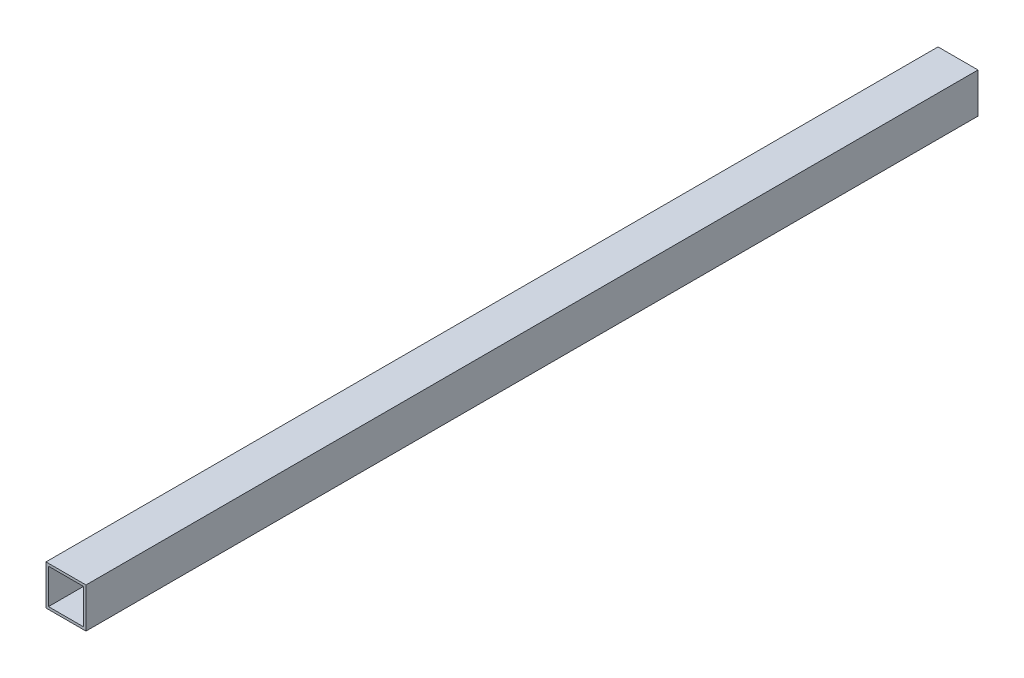
ISO-10303-21;
HEADER;
FILE_DESCRIPTION(('STEP AP214'),'2;1');
FILE_NAME('part.step','',(''),(''),'','','');
FILE_SCHEMA(('AUTOMOTIVE_DESIGN { 1 0 10303 214 1 1 1 1 }'));
ENDSEC;
DATA;
#1=APPLICATION_CONTEXT('core data for automotive mechanical design processes');
#2=APPLICATION_PROTOCOL_DEFINITION('international standard','automotive_design',2000,#1);
#3=PRODUCT_CONTEXT('',#1,'mechanical');
#4=PRODUCT('Part','Part','',(#3));
#5=PRODUCT_RELATED_PRODUCT_CATEGORY('part','',(#4));
#6=PRODUCT_DEFINITION_FORMATION('','',#4);
#7=PRODUCT_DEFINITION_CONTEXT('part definition',#1,'design');
#8=PRODUCT_DEFINITION('design','',#6,#7);
#9=PRODUCT_DEFINITION_SHAPE('','',#8);
#10=(LENGTH_UNIT() NAMED_UNIT(*) SI_UNIT(.MILLI.,.METRE.));
#11=(NAMED_UNIT(*) PLANE_ANGLE_UNIT() SI_UNIT($,.RADIAN.));
#12=(NAMED_UNIT(*) SI_UNIT($,.STERADIAN.) SOLID_ANGLE_UNIT());
#13=UNCERTAINTY_MEASURE_WITH_UNIT(LENGTH_MEASURE(1.E-05),#10,'distance_accuracy_value','');
#14=(GEOMETRIC_REPRESENTATION_CONTEXT(3) GLOBAL_UNCERTAINTY_ASSIGNED_CONTEXT((#13)) GLOBAL_UNIT_ASSIGNED_CONTEXT((#10,
#11,#12)) REPRESENTATION_CONTEXT('',''));
#15=CARTESIAN_POINT('',(0.,0.,0.));
#16=DIRECTION('',(0.,0.,1.));
#17=DIRECTION('',(1.,0.,0.));
#18=AXIS2_PLACEMENT_3D('',#15,#16,#17);
#19=CARTESIAN_POINT('',(0.,0.,-1700.));
#20=DIRECTION('',(-1.,0.,0.));
#21=DIRECTION('',(0.,-1.,0.));
#22=AXIS2_PLACEMENT_3D('',#19,#20,#21);
#23=PLANE('',#22);
#24=DIRECTION('',(0.,-1.,0.));
#25=VECTOR('',#24,1.);
#26=CARTESIAN_POINT('',(0.,0.,0.));
#27=LINE('',#26,#25);
#28=CARTESIAN_POINT('',(0.,0.,0.));
#29=VERTEX_POINT('',#28);
#30=CARTESIAN_POINT('',(0.,-76.2,0.));
#31=VERTEX_POINT('',#30);
#32=EDGE_CURVE('E133',#29,#31,#27,.T.);
#33=ORIENTED_EDGE('',*,*,#32,.F.);
#34=DIRECTION('',(0.,0.,1.));
#35=VECTOR('',#34,1.);
#36=CARTESIAN_POINT('',(0.,0.,-1700.));
#37=LINE('',#36,#35);
#38=CARTESIAN_POINT('',(0.,0.,-1700.));
#39=VERTEX_POINT('',#38);
#40=EDGE_CURVE('E11',#39,#29,#37,.T.);
#41=ORIENTED_EDGE('',*,*,#40,.F.);
#42=DIRECTION('',(0.,-1.,0.));
#43=VECTOR('',#42,1.);
#44=CARTESIAN_POINT('',(0.,0.,-1700.));
#45=LINE('',#44,#43);
#46=CARTESIAN_POINT('',(0.,-76.2,-1700.));
#47=VERTEX_POINT('',#46);
#48=EDGE_CURVE('E137',#39,#47,#45,.T.);
#49=ORIENTED_EDGE('',*,*,#48,.T.);
#50=DIRECTION('',(0.,0.,1.));
#51=VECTOR('',#50,1.);
#52=CARTESIAN_POINT('',(0.,-76.2,-1700.));
#53=LINE('',#52,#51);
#54=EDGE_CURVE('E38',#47,#31,#53,.T.);
#55=ORIENTED_EDGE('',*,*,#54,.T.);
#56=EDGE_LOOP('',(#33,#41,#49,#55));
#57=FACE_BOUND('',#56,.T.);
#58=ADVANCED_FACE('F35',(#57),#23,.T.);
#59=CARTESIAN_POINT('',(0.,0.,-1700.));
#60=DIRECTION('',(0.,1.,0.));
#61=DIRECTION('',(0.,0.,1.));
#62=AXIS2_PLACEMENT_3D('',#59,#60,#61);
#63=PLANE('',#62);
#64=DIRECTION('',(-1.,0.,0.));
#65=VECTOR('',#64,1.);
#66=CARTESIAN_POINT('',(0.,0.,0.));
#67=LINE('',#66,#65);
#68=CARTESIAN_POINT('',(76.2,0.,0.));
#69=VERTEX_POINT('',#68);
#70=EDGE_CURVE('E141',#69,#29,#67,.T.);
#71=ORIENTED_EDGE('',*,*,#70,.F.);
#72=DIRECTION('',(0.,0.,1.));
#73=VECTOR('',#72,1.);
#74=CARTESIAN_POINT('',(76.2,0.,-1700.));
#75=LINE('',#74,#73);
#76=CARTESIAN_POINT('',(76.2,0.,-1700.));
#77=VERTEX_POINT('',#76);
#78=EDGE_CURVE('E43',#77,#69,#75,.T.);
#79=ORIENTED_EDGE('',*,*,#78,.F.);
#80=DIRECTION('',(-1.,0.,0.));
#81=VECTOR('',#80,1.);
#82=CARTESIAN_POINT('',(0.,0.,-1700.));
#83=LINE('',#82,#81);
#84=EDGE_CURVE('E147',#77,#39,#83,.T.);
#85=ORIENTED_EDGE('',*,*,#84,.T.);
#86=ORIENTED_EDGE('',*,*,#40,.T.);
#87=EDGE_LOOP('',(#71,#79,#85,#86));
#88=FACE_BOUND('',#87,.T.);
#89=ADVANCED_FACE('F173',(#88),#63,.T.);
#90=CARTESIAN_POINT('',(76.2,0.,-1700.));
#91=DIRECTION('',(1.,0.,0.));
#92=DIRECTION('',(0.,1.,0.));
#93=AXIS2_PLACEMENT_3D('',#90,#91,#92);
#94=PLANE('',#93);
#95=DIRECTION('',(0.,1.,0.));
#96=VECTOR('',#95,1.);
#97=CARTESIAN_POINT('',(76.2,0.,0.));
#98=LINE('',#97,#96);
#99=CARTESIAN_POINT('',(76.2,-76.2,0.));
#100=VERTEX_POINT('',#99);
#101=EDGE_CURVE('E155',#100,#69,#98,.T.);
#102=ORIENTED_EDGE('',*,*,#101,.F.);
#103=DIRECTION('',(0.,0.,1.));
#104=VECTOR('',#103,1.);
#105=CARTESIAN_POINT('',(76.2,-76.2,-1700.));
#106=LINE('',#105,#104);
#107=CARTESIAN_POINT('',(76.2,-76.2,-1700.));
#108=VERTEX_POINT('',#107);
#109=EDGE_CURVE('E160',#108,#100,#106,.T.);
#110=ORIENTED_EDGE('',*,*,#109,.F.);
#111=DIRECTION('',(0.,1.,0.));
#112=VECTOR('',#111,1.);
#113=CARTESIAN_POINT('',(76.2,0.,-1700.));
#114=LINE('',#113,#112);
#115=EDGE_CURVE('E144',#108,#77,#114,.T.);
#116=ORIENTED_EDGE('',*,*,#115,.T.);
#117=ORIENTED_EDGE('',*,*,#78,.T.);
#118=EDGE_LOOP('',(#102,#110,#116,#117));
#119=FACE_BOUND('',#118,.T.);
#120=ADVANCED_FACE('F177',(#119),#94,.T.);
#121=CARTESIAN_POINT('',(0.,-76.2,-1700.));
#122=DIRECTION('',(0.,-1.,0.));
#123=DIRECTION('',(0.,0.,-1.));
#124=AXIS2_PLACEMENT_3D('',#121,#122,#123);
#125=PLANE('',#124);
#126=DIRECTION('',(1.,0.,0.));
#127=VECTOR('',#126,1.);
#128=CARTESIAN_POINT('',(0.,-76.2,0.));
#129=LINE('',#128,#127);
#130=EDGE_CURVE('E152',#31,#100,#129,.T.);
#131=ORIENTED_EDGE('',*,*,#130,.F.);
#132=ORIENTED_EDGE('',*,*,#54,.F.);
#133=DIRECTION('',(1.,0.,0.));
#134=VECTOR('',#133,1.);
#135=CARTESIAN_POINT('',(0.,-76.2,-1700.));
#136=LINE('',#135,#134);
#137=EDGE_CURVE('E140',#47,#108,#136,.T.);
#138=ORIENTED_EDGE('',*,*,#137,.T.);
#139=ORIENTED_EDGE('',*,*,#109,.T.);
#140=EDGE_LOOP('',(#131,#132,#138,#139));
#141=FACE_BOUND('',#140,.T.);
#142=ADVANCED_FACE('F168',(#141),#125,.T.);
#143=CARTESIAN_POINT('',(0.,0.,-1700.));
#144=DIRECTION('',(0.,0.,1.));
#145=DIRECTION('',(1.,0.,0.));
#146=AXIS2_PLACEMENT_3D('',#143,#144,#145);
#147=PLANE('',#146);
#148=DIRECTION('',(-1.,0.,0.));
#149=VECTOR('',#148,1.);
#150=CARTESIAN_POINT('',(4.7625,-4.7625,-1700.));
#151=LINE('',#150,#149);
#152=CARTESIAN_POINT('',(71.4375,-4.7625,-1700.));
#153=VERTEX_POINT('',#152);
#154=CARTESIAN_POINT('',(4.7625,-4.7625,-1700.));
#155=VERTEX_POINT('',#154);
#156=EDGE_CURVE('E108',#153,#155,#151,.T.);
#157=ORIENTED_EDGE('',*,*,#156,.T.);
#158=DIRECTION('',(0.,-1.,0.));
#159=VECTOR('',#158,1.);
#160=CARTESIAN_POINT('',(4.7625,-4.7625,-1700.));
#161=LINE('',#160,#159);
#162=CARTESIAN_POINT('',(4.7625,-71.4375,-1700.));
#163=VERTEX_POINT('',#162);
#164=EDGE_CURVE('E102',#155,#163,#161,.T.);
#165=ORIENTED_EDGE('',*,*,#164,.T.);
#166=DIRECTION('',(1.,0.,0.));
#167=VECTOR('',#166,1.);
#168=CARTESIAN_POINT('',(4.7625,-71.4375,-1700.));
#169=LINE('',#168,#167);
#170=CARTESIAN_POINT('',(71.4375,-71.4375,-1700.));
#171=VERTEX_POINT('',#170);
#172=EDGE_CURVE('E111',#163,#171,#169,.T.);
#173=ORIENTED_EDGE('',*,*,#172,.T.);
#174=DIRECTION('',(0.,1.,0.));
#175=VECTOR('',#174,1.);
#176=CARTESIAN_POINT('',(71.4375,-4.7625,-1700.));
#177=LINE('',#176,#175);
#178=EDGE_CURVE('E51',#171,#153,#177,.T.);
#179=ORIENTED_EDGE('',*,*,#178,.T.);
#180=EDGE_LOOP('',(#157,#165,#173,#179));
#181=FACE_BOUND('',#180,.T.);
#182=ORIENTED_EDGE('',*,*,#48,.F.);
#183=ORIENTED_EDGE('',*,*,#84,.F.);
#184=ORIENTED_EDGE('',*,*,#115,.F.);
#185=ORIENTED_EDGE('',*,*,#137,.F.);
#186=EDGE_LOOP('',(#182,#183,#184,#185));
#187=FACE_BOUND('',#186,.T.);
#188=ADVANCED_FACE('F115',(#181,#187),#147,.F.);
#189=CARTESIAN_POINT('',(0.,0.,0.));
#190=DIRECTION('',(0.,0.,1.));
#191=DIRECTION('',(1.,0.,0.));
#192=AXIS2_PLACEMENT_3D('',#189,#190,#191);
#193=PLANE('',#192);
#194=DIRECTION('',(0.,-1.,0.));
#195=VECTOR('',#194,1.);
#196=CARTESIAN_POINT('',(4.7625,-4.7625,0.));
#197=LINE('',#196,#195);
#198=CARTESIAN_POINT('',(4.7625,-4.7625,0.));
#199=VERTEX_POINT('',#198);
#200=CARTESIAN_POINT('',(4.7625,-71.4375,0.));
#201=VERTEX_POINT('',#200);
#202=EDGE_CURVE('E59',#199,#201,#197,.T.);
#203=ORIENTED_EDGE('',*,*,#202,.F.);
#204=DIRECTION('',(-1.,0.,0.));
#205=VECTOR('',#204,1.);
#206=CARTESIAN_POINT('',(4.7625,-4.7625,0.));
#207=LINE('',#206,#205);
#208=CARTESIAN_POINT('',(71.4375,-4.7625,0.));
#209=VERTEX_POINT('',#208);
#210=EDGE_CURVE('E118',#209,#199,#207,.T.);
#211=ORIENTED_EDGE('',*,*,#210,.F.);
#212=DIRECTION('',(0.,1.,0.));
#213=VECTOR('',#212,1.);
#214=CARTESIAN_POINT('',(71.4375,-4.7625,0.));
#215=LINE('',#214,#213);
#216=CARTESIAN_POINT('',(71.4375,-71.4375,0.));
#217=VERTEX_POINT('',#216);
#218=EDGE_CURVE('E121',#217,#209,#215,.T.);
#219=ORIENTED_EDGE('',*,*,#218,.F.);
#220=DIRECTION('',(1.,0.,0.));
#221=VECTOR('',#220,1.);
#222=CARTESIAN_POINT('',(4.7625,-71.4375,0.));
#223=LINE('',#222,#221);
#224=EDGE_CURVE('E127',#201,#217,#223,.T.);
#225=ORIENTED_EDGE('',*,*,#224,.F.);
#226=EDGE_LOOP('',(#203,#211,#219,#225));
#227=FACE_BOUND('',#226,.T.);
#228=ORIENTED_EDGE('',*,*,#32,.T.);
#229=ORIENTED_EDGE('',*,*,#130,.T.);
#230=ORIENTED_EDGE('',*,*,#101,.T.);
#231=ORIENTED_EDGE('',*,*,#70,.T.);
#232=EDGE_LOOP('',(#228,#229,#230,#231));
#233=FACE_BOUND('',#232,.T.);
#234=ADVANCED_FACE('F170',(#227,#233),#193,.T.);
#235=CARTESIAN_POINT('',(4.7625,-4.7625,-1700.));
#236=DIRECTION('',(-1.,0.,0.));
#237=DIRECTION('',(0.,0.,1.));
#238=AXIS2_PLACEMENT_3D('',#235,#236,#237);
#239=PLANE('',#238);
#240=ORIENTED_EDGE('',*,*,#202,.T.);
#241=DIRECTION('',(0.,0.,1.));
#242=VECTOR('',#241,1.);
#243=CARTESIAN_POINT('',(4.7625,-71.4375,-1700.));
#244=LINE('',#243,#242);
#245=EDGE_CURVE('E98',#163,#201,#244,.T.);
#246=ORIENTED_EDGE('',*,*,#245,.F.);
#247=ORIENTED_EDGE('',*,*,#164,.F.);
#248=DIRECTION('',(0.,0.,1.));
#249=VECTOR('',#248,1.);
#250=CARTESIAN_POINT('',(4.7625,-4.7625,-1700.));
#251=LINE('',#250,#249);
#252=EDGE_CURVE('E131',#155,#199,#251,.T.);
#253=ORIENTED_EDGE('',*,*,#252,.T.);
#254=EDGE_LOOP('',(#240,#246,#247,#253));
#255=FACE_BOUND('',#254,.T.);
#256=ADVANCED_FACE('F100',(#255),#239,.F.);
#257=CARTESIAN_POINT('',(4.7625,-4.7625,-1700.));
#258=DIRECTION('',(0.,1.,0.));
#259=DIRECTION('',(0.,0.,1.));
#260=AXIS2_PLACEMENT_3D('',#257,#258,#259);
#261=PLANE('',#260);
#262=ORIENTED_EDGE('',*,*,#210,.T.);
#263=ORIENTED_EDGE('',*,*,#252,.F.);
#264=ORIENTED_EDGE('',*,*,#156,.F.);
#265=DIRECTION('',(0.,0.,1.));
#266=VECTOR('',#265,1.);
#267=CARTESIAN_POINT('',(71.4375,-4.7625,-1700.));
#268=LINE('',#267,#266);
#269=EDGE_CURVE('E134',#153,#209,#268,.T.);
#270=ORIENTED_EDGE('',*,*,#269,.T.);
#271=EDGE_LOOP('',(#262,#263,#264,#270));
#272=FACE_BOUND('',#271,.T.);
#273=ADVANCED_FACE('F228',(#272),#261,.F.);
#274=CARTESIAN_POINT('',(71.4375,-4.7625,-1700.));
#275=DIRECTION('',(1.,0.,0.));
#276=DIRECTION('',(0.,0.,-1.));
#277=AXIS2_PLACEMENT_3D('',#274,#275,#276);
#278=PLANE('',#277);
#279=ORIENTED_EDGE('',*,*,#218,.T.);
#280=ORIENTED_EDGE('',*,*,#269,.F.);
#281=ORIENTED_EDGE('',*,*,#178,.F.);
#282=DIRECTION('',(0.,0.,1.));
#283=VECTOR('',#282,1.);
#284=CARTESIAN_POINT('',(71.4375,-71.4375,-1700.));
#285=LINE('',#284,#283);
#286=EDGE_CURVE('E107',#171,#217,#285,.T.);
#287=ORIENTED_EDGE('',*,*,#286,.T.);
#288=EDGE_LOOP('',(#279,#280,#281,#287));
#289=FACE_BOUND('',#288,.T.);
#290=ADVANCED_FACE('F237',(#289),#278,.F.);
#291=CARTESIAN_POINT('',(4.7625,-71.4375,-1700.));
#292=DIRECTION('',(0.,-1.,0.));
#293=DIRECTION('',(0.,0.,-1.));
#294=AXIS2_PLACEMENT_3D('',#291,#292,#293);
#295=PLANE('',#294);
#296=ORIENTED_EDGE('',*,*,#224,.T.);
#297=ORIENTED_EDGE('',*,*,#286,.F.);
#298=ORIENTED_EDGE('',*,*,#172,.F.);
#299=ORIENTED_EDGE('',*,*,#245,.T.);
#300=EDGE_LOOP('',(#296,#297,#298,#299));
#301=FACE_BOUND('',#300,.T.);
#302=ADVANCED_FACE('F112',(#301),#295,.F.);
#303=CLOSED_SHELL('',(#58,#89,#120,#142,#188,#234,#256,#273,#290,#302));
#304=MANIFOLD_SOLID_BREP('B2',#303);
#305=ADVANCED_BREP_SHAPE_REPRESENTATION('',(#18,#304),#14);
#306=SHAPE_DEFINITION_REPRESENTATION(#9,#305);
ENDSEC;
END-ISO-10303-21;
